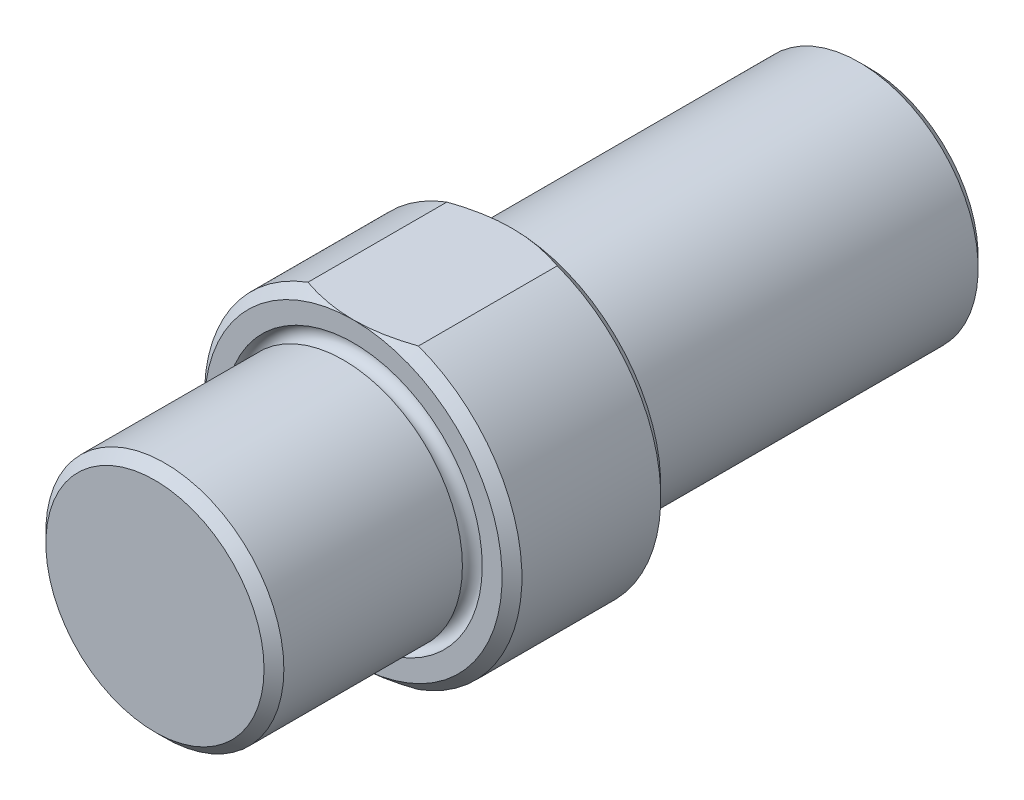
ISO-10303-21;
HEADER;
FILE_DESCRIPTION(('STEP AP214'),'2;1');
FILE_NAME('part.step','',(''),(''),'','','');
FILE_SCHEMA(('AUTOMOTIVE_DESIGN { 1 0 10303 214 1 1 1 1 }'));
ENDSEC;
DATA;
#1=APPLICATION_CONTEXT('core data for automotive mechanical design processes');
#2=APPLICATION_PROTOCOL_DEFINITION('international standard','automotive_design',2000,#1);
#3=PRODUCT_CONTEXT('',#1,'mechanical');
#4=PRODUCT('Part','Part','',(#3));
#5=PRODUCT_RELATED_PRODUCT_CATEGORY('part','',(#4));
#6=PRODUCT_DEFINITION_FORMATION('','',#4);
#7=PRODUCT_DEFINITION_CONTEXT('part definition',#1,'design');
#8=PRODUCT_DEFINITION('design','',#6,#7);
#9=PRODUCT_DEFINITION_SHAPE('','',#8);
#10=(LENGTH_UNIT() NAMED_UNIT(*) SI_UNIT(.MILLI.,.METRE.));
#11=(NAMED_UNIT(*) PLANE_ANGLE_UNIT() SI_UNIT($,.RADIAN.));
#12=(NAMED_UNIT(*) SI_UNIT($,.STERADIAN.) SOLID_ANGLE_UNIT());
#13=UNCERTAINTY_MEASURE_WITH_UNIT(LENGTH_MEASURE(1.E-05),#10,'distance_accuracy_value','');
#14=(GEOMETRIC_REPRESENTATION_CONTEXT(3) GLOBAL_UNCERTAINTY_ASSIGNED_CONTEXT((#13)) GLOBAL_UNIT_ASSIGNED_CONTEXT((#10,
#11,#12)) REPRESENTATION_CONTEXT('',''));
#15=CARTESIAN_POINT('',(0.,0.,0.));
#16=DIRECTION('',(0.,0.,1.));
#17=DIRECTION('',(1.,0.,0.));
#18=AXIS2_PLACEMENT_3D('',#15,#16,#17);
#19=CARTESIAN_POINT('',(0.,0.,-9.));
#20=DIRECTION('',(0.,0.,-1.));
#21=DIRECTION('',(-1.,0.,0.));
#22=AXIS2_PLACEMENT_3D('',#19,#20,#21);
#23=CYLINDRICAL_SURFACE('',#22,4.);
#24=DIRECTION('',(0.,0.,-1.));
#25=VECTOR('',#24,1.);
#26=CARTESIAN_POINT('',(-1.39194109070751,3.75,9.001));
#27=LINE('',#26,#25);
#28=CARTESIAN_POINT('',(-1.39194109070751,3.75,3.75));
#29=VERTEX_POINT('',#28);
#30=CARTESIAN_POINT('',(-1.39194109070751,3.75,0.250000000000002));
#31=VERTEX_POINT('',#30);
#32=EDGE_CURVE('E105',#29,#31,#27,.T.);
#33=ORIENTED_EDGE('',*,*,#32,.T.);
#34=CARTESIAN_POINT('',(0.,0.,0.250000000000002));
#35=DIRECTION('',(0.,0.,-1.));
#36=DIRECTION('',(-1.,0.,0.));
#37=AXIS2_PLACEMENT_3D('',#34,#35,#36);
#38=CIRCLE('',#37,4.);
#39=CARTESIAN_POINT('',(-1.39194109070751,-3.75,0.250000000000002));
#40=VERTEX_POINT('',#39);
#41=EDGE_CURVE('E120',#31,#40,#38,.F.);
#42=ORIENTED_EDGE('',*,*,#41,.T.);
#43=DIRECTION('',(0.,0.,-1.));
#44=VECTOR('',#43,1.);
#45=CARTESIAN_POINT('',(-1.39194109070751,-3.75,9.001));
#46=LINE('',#45,#44);
#47=CARTESIAN_POINT('',(-1.39194109070751,-3.75,3.75));
#48=VERTEX_POINT('',#47);
#49=EDGE_CURVE('E116',#48,#40,#46,.T.);
#50=ORIENTED_EDGE('',*,*,#49,.F.);
#51=CARTESIAN_POINT('',(0.,0.,3.75));
#52=DIRECTION('',(0.,0.,1.));
#53=DIRECTION('',(1.,0.,0.));
#54=AXIS2_PLACEMENT_3D('',#51,#52,#53);
#55=CIRCLE('',#54,4.);
#56=EDGE_CURVE('E126',#48,#29,#55,.F.);
#57=ORIENTED_EDGE('',*,*,#56,.T.);
#58=EDGE_LOOP('',(#33,#42,#50,#57));
#59=FACE_BOUND('',#58,.T.);
#60=ADVANCED_FACE('F36',(#59),#23,.T.);
#61=DIRECTION('',(0.,0.,-1.));
#62=VECTOR('',#61,1.);
#63=CARTESIAN_POINT('',(1.39194109070751,3.75,9.001));
#64=LINE('',#63,#62);
#65=CARTESIAN_POINT('',(1.39194109070751,3.75,3.75));
#66=VERTEX_POINT('',#65);
#67=CARTESIAN_POINT('',(1.39194109070751,3.75,0.250000000000002));
#68=VERTEX_POINT('',#67);
#69=EDGE_CURVE('E94',#66,#68,#64,.T.);
#70=ORIENTED_EDGE('',*,*,#69,.F.);
#71=CARTESIAN_POINT('',(1.39194109070751,-3.75,3.75));
#72=VERTEX_POINT('',#71);
#73=EDGE_CURVE('E128',#66,#72,#55,.F.);
#74=ORIENTED_EDGE('',*,*,#73,.T.);
#75=DIRECTION('',(0.,0.,-1.));
#76=VECTOR('',#75,1.);
#77=CARTESIAN_POINT('',(1.39194109070751,-3.75,9.001));
#78=LINE('',#77,#76);
#79=CARTESIAN_POINT('',(1.39194109070751,-3.75,0.250000000000002));
#80=VERTEX_POINT('',#79);
#81=EDGE_CURVE('E57',#72,#80,#78,.T.);
#82=ORIENTED_EDGE('',*,*,#81,.T.);
#83=EDGE_CURVE('E112',#80,#68,#38,.F.);
#84=ORIENTED_EDGE('',*,*,#83,.T.);
#85=EDGE_LOOP('',(#70,#74,#82,#84));
#86=FACE_BOUND('',#85,.T.);
#87=ADVANCED_FACE('F118',(#86),#23,.T.);
#88=CARTESIAN_POINT('',(0.,0.,0.));
#89=DIRECTION('',(0.,0.,1.));
#90=DIRECTION('',(1.,0.,0.));
#91=AXIS2_PLACEMENT_3D('',#88,#89,#90);
#92=CONICAL_SURFACE('',#91,3.75,0.785398163397448);
#93=CARTESIAN_POINT('',(-2.83990302461033,3.75,0.953992898505576));
#94=CARTESIAN_POINT('',(-2.7700876978384,3.75,0.911848513247995));
#95=CARTESIAN_POINT('',(-2.69984026379134,3.75,0.870421234461964));
#96=CARTESIAN_POINT('',(-2.55837884209773,3.75,0.789211299667289));
#97=CARTESIAN_POINT('',(-2.48716461766492,3.75,0.749429056578152));
#98=CARTESIAN_POINT('',(-2.27139059548043,3.75,0.632582593046648));
#99=CARTESIAN_POINT('',(-2.12526282812416,3.75,0.558363208487286));
#100=CARTESIAN_POINT('',(-1.82547988151603,3.75,0.418567933278475));
#101=CARTESIAN_POINT('',(-1.67173431523207,3.75,0.353183752552045));
#102=CARTESIAN_POINT('',(-1.35927190282821,3.75,0.236130087775243));
#103=CARTESIAN_POINT('',(-1.20056430539099,3.75,0.18443661216764));
#104=CARTESIAN_POINT('',(-0.946149795688594,3.75,0.11647014506675));
#105=CARTESIAN_POINT('',(-0.85197236253903,3.75,0.0944385679532498));
#106=CARTESIAN_POINT('',(-0.662301493652173,3.75,0.0569028380975851));
#107=CARTESIAN_POINT('',(-0.566807994216014,3.75,0.0413990024583298));
#108=CARTESIAN_POINT('',(-0.375790116903576,3.75,0.0176016198684037));
#109=CARTESIAN_POINT('',(-0.280273737092508,3.75,0.00924449484104384));
#110=CARTESIAN_POINT('',(-0.088878098705273,3.75,-0.0001651186600835));
#111=CARTESIAN_POINT('',(0.00700116817843397,3.75,-0.00121743888119184));
#112=CARTESIAN_POINT('',(0.214560681022876,3.75,0.00447257727150637));
#113=CARTESIAN_POINT('',(0.326206265213885,3.75,0.0125456924188819));
#114=CARTESIAN_POINT('',(0.548388105524635,3.75,0.0382764686106016));
#115=CARTESIAN_POINT('',(0.658924130416132,3.75,0.0559360868815942));
#116=CARTESIAN_POINT('',(0.87963236825723,3.75,0.100247950720254));
#117=CARTESIAN_POINT('',(0.989781727852693,3.75,0.127012639235166));
#118=CARTESIAN_POINT('',(1.20784034622565,3.75,0.188327582182318));
#119=CARTESIAN_POINT('',(1.31575000876604,3.75,0.222876419771478));
#120=CARTESIAN_POINT('',(1.55071732291589,3.75,0.306209928863826));
#121=CARTESIAN_POINT('',(1.67725179091024,3.75,0.356460362006968));
#122=CARTESIAN_POINT('',(1.92702140820888,3.75,0.464644449458482));
#123=CARTESIAN_POINT('',(2.05025490423548,3.75,0.522581870373216));
#124=CARTESIAN_POINT('',(2.29404704517215,3.75,0.644768318976301));
#125=CARTESIAN_POINT('',(2.41459529351872,3.75,0.709037929671192));
#126=CARTESIAN_POINT('',(2.65291313964417,3.75,0.842461488598317));
#127=CARTESIAN_POINT('',(2.7706831940413,3.75,0.911614626616626));
#128=CARTESIAN_POINT('',(2.99867808102538,3.75,1.05070605159649));
#129=CARTESIAN_POINT('',(3.10900662010968,3.75,1.12047523006144));
#130=CARTESIAN_POINT('',(3.32776138837851,3.75,1.26294433980188));
#131=CARTESIAN_POINT('',(3.43618746466738,3.75,1.33564450509829));
#132=CARTESIAN_POINT('',(3.6504914902698,3.75,1.48283495569862));
#133=CARTESIAN_POINT('',(3.75638311158588,3.75,1.5573054065924));
#134=CARTESIAN_POINT('',(3.96671630494178,3.75,1.70820733340868));
#135=CARTESIAN_POINT('',(4.07115827626302,3.75,1.78463825214523));
#136=CARTESIAN_POINT('',(4.17499451194071,3.75,1.86186949017304));
#137=B_SPLINE_CURVE_WITH_KNOTS('',3,(#93,#94,#95,#96,#97,#98,#99,#100,#101,#102,#103,#104,#105,
#106,#107,#108,#109,#110,#111,#112,#113,#114,#115,#116,#117,#118,#119,#120,#121,#122,#123,#124,
#125,#126,#127,#128,#129,#130,#131,#132,#133,#134,#135,#136),.UNSPECIFIED.,.F.,.F.,(4,2,2,2,2,2,
2,2,2,2,2,2,2,2,2,2,2,2,2,2,2,4),(0.,0.244640033858274,0.489341106472247,0.980722318903447,
1.48146935334974,1.98133298505972,2.27129835540577,2.56127780998864,2.84864990570157,
3.13602862047691,3.47138980730315,3.80681948884968,4.14655173037683,4.48622218493553,
4.89433802676435,5.30265458809713,5.71234516832156,6.12196793676241,6.51352671514245,
6.90511681919381,7.29346089465381,7.68169579547187),.UNSPECIFIED.);
#138=CARTESIAN_POINT('',(0.,3.75,0.));
#139=VERTEX_POINT('',#138);
#140=EDGE_CURVE('E97',#139,#68,#137,.T.);
#141=ORIENTED_EDGE('',*,*,#140,.T.);
#142=ORIENTED_EDGE('',*,*,#83,.F.);
#143=CARTESIAN_POINT('',(-2.83990302461033,-3.75,0.953992898505576));
#144=CARTESIAN_POINT('',(-2.7700876978384,-3.75,0.911848513247995));
#145=CARTESIAN_POINT('',(-2.69984026379134,-3.75,0.870421234461964));
#146=CARTESIAN_POINT('',(-2.55837884209773,-3.75,0.789211299667289));
#147=CARTESIAN_POINT('',(-2.48716461766492,-3.75,0.749429056578152));
#148=CARTESIAN_POINT('',(-2.27139059548043,-3.75,0.632582593046648));
#149=CARTESIAN_POINT('',(-2.12526282812416,-3.75,0.558363208487286));
#150=CARTESIAN_POINT('',(-1.82547988151603,-3.75,0.418567933278475));
#151=CARTESIAN_POINT('',(-1.67173431523207,-3.75,0.353183752552045));
#152=CARTESIAN_POINT('',(-1.35927190282821,-3.75,0.236130087775243));
#153=CARTESIAN_POINT('',(-1.20056430539099,-3.75,0.18443661216764));
#154=CARTESIAN_POINT('',(-0.946149795688594,-3.75,0.11647014506675));
#155=CARTESIAN_POINT('',(-0.85197236253903,-3.75,0.0944385679532498));
#156=CARTESIAN_POINT('',(-0.662301493652173,-3.75,0.0569028380975851));
#157=CARTESIAN_POINT('',(-0.566807994216014,-3.75,0.0413990024583298));
#158=CARTESIAN_POINT('',(-0.375790116903576,-3.75,0.0176016198684037));
#159=CARTESIAN_POINT('',(-0.280273737092508,-3.75,0.00924449484104384));
#160=CARTESIAN_POINT('',(-0.088878098705273,-3.75,-0.0001651186600835));
#161=CARTESIAN_POINT('',(0.00700116817843397,-3.75,-0.00121743888119184));
#162=CARTESIAN_POINT('',(0.214560681022876,-3.75,0.00447257727150637));
#163=CARTESIAN_POINT('',(0.326206265213885,-3.75,0.0125456924188819));
#164=CARTESIAN_POINT('',(0.548388105524635,-3.75,0.0382764686106016));
#165=CARTESIAN_POINT('',(0.658924130416132,-3.75,0.0559360868815942));
#166=CARTESIAN_POINT('',(0.87963236825723,-3.75,0.100247950720254));
#167=CARTESIAN_POINT('',(0.989781727852693,-3.75,0.127012639235166));
#168=CARTESIAN_POINT('',(1.20784034622565,-3.75,0.188327582182318));
#169=CARTESIAN_POINT('',(1.31575000876604,-3.75,0.222876419771478));
#170=CARTESIAN_POINT('',(1.55071732291589,-3.75,0.306209928863826));
#171=CARTESIAN_POINT('',(1.67725179091024,-3.75,0.356460362006968));
#172=CARTESIAN_POINT('',(1.92702140820888,-3.75,0.464644449458482));
#173=CARTESIAN_POINT('',(2.05025490423548,-3.75,0.522581870373216));
#174=CARTESIAN_POINT('',(2.29404704517215,-3.75,0.644768318976301));
#175=CARTESIAN_POINT('',(2.41459529351872,-3.75,0.709037929671192));
#176=CARTESIAN_POINT('',(2.65291313964417,-3.75,0.842461488598317));
#177=CARTESIAN_POINT('',(2.7706831940413,-3.75,0.911614626616626));
#178=CARTESIAN_POINT('',(2.99867808102538,-3.75,1.05070605159649));
#179=CARTESIAN_POINT('',(3.10900662010968,-3.75,1.12047523006144));
#180=CARTESIAN_POINT('',(3.32776138837851,-3.75,1.26294433980188));
#181=CARTESIAN_POINT('',(3.43618746466738,-3.75,1.33564450509829));
#182=CARTESIAN_POINT('',(3.6504914902698,-3.75,1.48283495569862));
#183=CARTESIAN_POINT('',(3.75638311158588,-3.75,1.5573054065924));
#184=CARTESIAN_POINT('',(3.96671630494178,-3.75,1.70820733340868));
#185=CARTESIAN_POINT('',(4.07115827626302,-3.75,1.78463825214523));
#186=CARTESIAN_POINT('',(4.17499451194071,-3.75,1.86186949017304));
#187=B_SPLINE_CURVE_WITH_KNOTS('',3,(#143,#144,#145,#146,#147,#148,#149,#150,#151,#152,#153,
#154,#155,#156,#157,#158,#159,#160,#161,#162,#163,#164,#165,#166,#167,#168,#169,#170,#171,#172,
#173,#174,#175,#176,#177,#178,#179,#180,#181,#182,#183,#184,#185,#186),.UNSPECIFIED.,.F.,.F.,(4,
2,2,2,2,2,2,2,2,2,2,2,2,2,2,2,2,2,2,2,2,4),(0.,0.244640033858274,0.489341106472247,
0.980722318903447,1.48146935334974,1.98133298505972,2.27129835540577,2.56127780998864,
2.84864990570157,3.13602862047691,3.47138980730315,3.80681948884968,4.14655173037683,
4.48622218493553,4.89433802676435,5.30265458809713,5.71234516832156,6.12196793676241,
6.51352671514245,6.90511681919381,7.29346089465381,7.68169579547187),.UNSPECIFIED.);
#188=CARTESIAN_POINT('',(0.,-3.75,0.));
#189=VERTEX_POINT('',#188);
#190=EDGE_CURVE('E424',#189,#80,#187,.T.);
#191=ORIENTED_EDGE('',*,*,#190,.F.);
#192=CARTESIAN_POINT('',(0.,0.,0.));
#193=DIRECTION('',(0.,0.,-1.));
#194=DIRECTION('',(-1.,0.,0.));
#195=AXIS2_PLACEMENT_3D('',#192,#193,#194);
#196=CIRCLE('',#195,3.75);
#197=EDGE_CURVE('E114',#139,#189,#196,.T.);
#198=ORIENTED_EDGE('',*,*,#197,.F.);
#199=EDGE_LOOP('',(#141,#142,#191,#198));
#200=FACE_BOUND('',#199,.T.);
#201=ADVANCED_FACE('F110',(#200),#92,.T.);
#202=EDGE_CURVE('E115',#31,#139,#137,.T.);
#203=ORIENTED_EDGE('',*,*,#202,.T.);
#204=EDGE_CURVE('E192',#189,#139,#196,.T.);
#205=ORIENTED_EDGE('',*,*,#204,.F.);
#206=EDGE_CURVE('E164',#40,#189,#187,.T.);
#207=ORIENTED_EDGE('',*,*,#206,.F.);
#208=ORIENTED_EDGE('',*,*,#41,.F.);
#209=EDGE_LOOP('',(#203,#205,#207,#208));
#210=FACE_BOUND('',#209,.T.);
#211=ADVANCED_FACE('F203',(#210),#92,.T.);
#212=CARTESIAN_POINT('',(0.,0.,3.75));
#213=DIRECTION('',(0.,0.,-1.));
#214=DIRECTION('',(-1.,0.,0.));
#215=AXIS2_PLACEMENT_3D('',#212,#213,#214);
#216=CONICAL_SURFACE('',#215,4.,0.785398163397452);
#217=CARTESIAN_POINT('',(-2.83990302461034,3.75,3.04600710149442));
#218=CARTESIAN_POINT('',(-2.77008769783841,3.75,3.088151486752));
#219=CARTESIAN_POINT('',(-2.69984026379134,3.75,3.12957876553803));
#220=CARTESIAN_POINT('',(-2.55837884209774,3.75,3.21078870033271));
#221=CARTESIAN_POINT('',(-2.48716461766493,3.75,3.25057094342185));
#222=CARTESIAN_POINT('',(-2.27139059548043,3.75,3.36741740695335));
#223=CARTESIAN_POINT('',(-2.12526282812416,3.75,3.44163679151271));
#224=CARTESIAN_POINT('',(-1.82547988151603,3.75,3.58143206672152));
#225=CARTESIAN_POINT('',(-1.67173431523207,3.75,3.64681624744795));
#226=CARTESIAN_POINT('',(-1.35927190282822,3.75,3.76386991222475));
#227=CARTESIAN_POINT('',(-1.20056430539099,3.75,3.81556338783236));
#228=CARTESIAN_POINT('',(-0.946149795688595,3.75,3.88352985493325));
#229=CARTESIAN_POINT('',(-0.851972362539031,3.75,3.90556143204675));
#230=CARTESIAN_POINT('',(-0.662301493652174,3.75,3.94309716190241));
#231=CARTESIAN_POINT('',(-0.566807994216016,3.75,3.95860099754167));
#232=CARTESIAN_POINT('',(-0.375790116903577,3.75,3.98239838013159));
#233=CARTESIAN_POINT('',(-0.28027373709251,3.75,3.99075550515895));
#234=CARTESIAN_POINT('',(-0.0888780987052748,3.75,4.00016511866008));
#235=CARTESIAN_POINT('',(0.00700116817843205,3.75,4.00121743888119));
#236=CARTESIAN_POINT('',(0.214560681022875,3.75,3.99552742272849));
#237=CARTESIAN_POINT('',(0.326206265213884,3.75,3.98745430758111));
#238=CARTESIAN_POINT('',(0.548388105524637,3.75,3.96172353138939));
#239=CARTESIAN_POINT('',(0.658924130416134,3.75,3.9440639131184));
#240=CARTESIAN_POINT('',(0.879632368257233,3.75,3.89975204927974));
#241=CARTESIAN_POINT('',(0.989781727852697,3.75,3.87298736076483));
#242=CARTESIAN_POINT('',(1.20784034622566,3.75,3.81167241781768));
#243=CARTESIAN_POINT('',(1.31575000876605,3.75,3.77712358022852));
#244=CARTESIAN_POINT('',(1.5507173229159,3.75,3.69379007113617));
#245=CARTESIAN_POINT('',(1.67725179091025,3.75,3.64353963799303));
#246=CARTESIAN_POINT('',(1.9270214082089,3.75,3.53535555054151));
#247=CARTESIAN_POINT('',(2.05025490423549,3.75,3.47741812962678));
#248=CARTESIAN_POINT('',(2.29404704517217,3.75,3.35523168102369));
#249=CARTESIAN_POINT('',(2.41459529351874,3.75,3.2909620703288));
#250=CARTESIAN_POINT('',(2.6529131396442,3.75,3.15753851140167));
#251=CARTESIAN_POINT('',(2.77068319404133,3.75,3.08838537338336));
#252=CARTESIAN_POINT('',(2.9986780810254,3.75,2.9492939484035));
#253=CARTESIAN_POINT('',(3.10900662010971,3.75,2.87952476993854));
#254=CARTESIAN_POINT('',(3.32776138837854,3.75,2.7370556601981));
#255=CARTESIAN_POINT('',(3.43618746466741,3.75,2.6643554949017));
#256=CARTESIAN_POINT('',(3.65049149026984,3.75,2.51716504430136));
#257=CARTESIAN_POINT('',(3.75638311158592,3.75,2.44269459340758));
#258=CARTESIAN_POINT('',(3.96671630494182,3.75,2.2917926665913));
#259=CARTESIAN_POINT('',(4.07115827626306,3.75,2.21536174785475));
#260=CARTESIAN_POINT('',(4.17499451194075,3.75,2.13813050982694));
#261=B_SPLINE_CURVE_WITH_KNOTS('',3,(#217,#218,#219,#220,#221,#222,#223,#224,#225,#226,#227,
#228,#229,#230,#231,#232,#233,#234,#235,#236,#237,#238,#239,#240,#241,#242,#243,#244,#245,#246,
#247,#248,#249,#250,#251,#252,#253,#254,#255,#256,#257,#258,#259,#260),.UNSPECIFIED.,.F.,.F.,(4,
2,2,2,2,2,2,2,2,2,2,2,2,2,2,2,2,2,2,2,2,4),(0.,0.244640033858276,0.489341106472249,
0.980722318903451,1.48146935334975,1.98133298505973,2.27129835540577,2.56127780998864,
2.84864990570158,3.13602862047691,3.47138980730316,3.80681948884969,4.14655173037685,
4.48622218493554,4.89433802676437,5.30265458809715,5.71234516832159,6.12196793676244,
6.51352671514249,6.90511681919386,7.29346089465386,7.68169579547192),.UNSPECIFIED.);
#262=CARTESIAN_POINT('',(0.,3.75,4.));
#263=VERTEX_POINT('',#262);
#264=EDGE_CURVE('E11',#29,#263,#261,.T.);
#265=ORIENTED_EDGE('',*,*,#264,.F.);
#266=ORIENTED_EDGE('',*,*,#56,.F.);
#267=CARTESIAN_POINT('',(-2.83990302461034,-3.75,3.04600710149442));
#268=CARTESIAN_POINT('',(-2.77008769783841,-3.75,3.088151486752));
#269=CARTESIAN_POINT('',(-2.69984026379134,-3.75,3.12957876553803));
#270=CARTESIAN_POINT('',(-2.55837884209774,-3.75,3.21078870033271));
#271=CARTESIAN_POINT('',(-2.48716461766493,-3.75,3.25057094342185));
#272=CARTESIAN_POINT('',(-2.27139059548043,-3.75,3.36741740695335));
#273=CARTESIAN_POINT('',(-2.12526282812416,-3.75,3.44163679151271));
#274=CARTESIAN_POINT('',(-1.82547988151603,-3.75,3.58143206672152));
#275=CARTESIAN_POINT('',(-1.67173431523207,-3.75,3.64681624744795));
#276=CARTESIAN_POINT('',(-1.35927190282822,-3.75,3.76386991222475));
#277=CARTESIAN_POINT('',(-1.20056430539099,-3.75,3.81556338783236));
#278=CARTESIAN_POINT('',(-0.946149795688595,-3.75,3.88352985493325));
#279=CARTESIAN_POINT('',(-0.851972362539031,-3.75,3.90556143204675));
#280=CARTESIAN_POINT('',(-0.662301493652174,-3.75,3.94309716190241));
#281=CARTESIAN_POINT('',(-0.566807994216016,-3.75,3.95860099754167));
#282=CARTESIAN_POINT('',(-0.375790116903577,-3.75,3.98239838013159));
#283=CARTESIAN_POINT('',(-0.28027373709251,-3.75,3.99075550515895));
#284=CARTESIAN_POINT('',(-0.0888780987052748,-3.75,4.00016511866008));
#285=CARTESIAN_POINT('',(0.00700116817843205,-3.75,4.00121743888119));
#286=CARTESIAN_POINT('',(0.214560681022875,-3.75,3.99552742272849));
#287=CARTESIAN_POINT('',(0.326206265213884,-3.75,3.98745430758111));
#288=CARTESIAN_POINT('',(0.548388105524637,-3.75,3.96172353138939));
#289=CARTESIAN_POINT('',(0.658924130416134,-3.75,3.9440639131184));
#290=CARTESIAN_POINT('',(0.879632368257233,-3.75,3.89975204927974));
#291=CARTESIAN_POINT('',(0.989781727852697,-3.75,3.87298736076483));
#292=CARTESIAN_POINT('',(1.20784034622566,-3.75,3.81167241781768));
#293=CARTESIAN_POINT('',(1.31575000876605,-3.75,3.77712358022852));
#294=CARTESIAN_POINT('',(1.5507173229159,-3.75,3.69379007113617));
#295=CARTESIAN_POINT('',(1.67725179091025,-3.75,3.64353963799303));
#296=CARTESIAN_POINT('',(1.9270214082089,-3.75,3.53535555054151));
#297=CARTESIAN_POINT('',(2.05025490423549,-3.75,3.47741812962678));
#298=CARTESIAN_POINT('',(2.29404704517217,-3.75,3.35523168102369));
#299=CARTESIAN_POINT('',(2.41459529351874,-3.75,3.2909620703288));
#300=CARTESIAN_POINT('',(2.6529131396442,-3.75,3.15753851140167));
#301=CARTESIAN_POINT('',(2.77068319404133,-3.75,3.08838537338336));
#302=CARTESIAN_POINT('',(2.9986780810254,-3.75,2.9492939484035));
#303=CARTESIAN_POINT('',(3.10900662010971,-3.75,2.87952476993854));
#304=CARTESIAN_POINT('',(3.32776138837854,-3.75,2.7370556601981));
#305=CARTESIAN_POINT('',(3.43618746466741,-3.75,2.6643554949017));
#306=CARTESIAN_POINT('',(3.65049149026984,-3.75,2.51716504430136));
#307=CARTESIAN_POINT('',(3.75638311158592,-3.75,2.44269459340758));
#308=CARTESIAN_POINT('',(3.96671630494182,-3.75,2.2917926665913));
#309=CARTESIAN_POINT('',(4.07115827626306,-3.75,2.21536174785475));
#310=CARTESIAN_POINT('',(4.17499451194075,-3.75,2.13813050982694));
#311=B_SPLINE_CURVE_WITH_KNOTS('',3,(#267,#268,#269,#270,#271,#272,#273,#274,#275,#276,#277,
#278,#279,#280,#281,#282,#283,#284,#285,#286,#287,#288,#289,#290,#291,#292,#293,#294,#295,#296,
#297,#298,#299,#300,#301,#302,#303,#304,#305,#306,#307,#308,#309,#310),.UNSPECIFIED.,.F.,.F.,(4,
2,2,2,2,2,2,2,2,2,2,2,2,2,2,2,2,2,2,2,2,4),(0.,0.244640033858276,0.489341106472249,
0.980722318903451,1.48146935334975,1.98133298505973,2.27129835540577,2.56127780998864,
2.84864990570158,3.13602862047691,3.47138980730316,3.80681948884969,4.14655173037685,
4.48622218493554,4.89433802676437,5.30265458809715,5.71234516832159,6.12196793676244,
6.51352671514249,6.90511681919386,7.29346089465386,7.68169579547192),.UNSPECIFIED.);
#312=CARTESIAN_POINT('',(0.,-3.75,4.));
#313=VERTEX_POINT('',#312);
#314=EDGE_CURVE('E50',#48,#313,#311,.T.);
#315=ORIENTED_EDGE('',*,*,#314,.T.);
#316=CARTESIAN_POINT('',(0.,0.,4.));
#317=DIRECTION('',(0.,0.,1.));
#318=DIRECTION('',(1.,0.,0.));
#319=AXIS2_PLACEMENT_3D('',#316,#317,#318);
#320=CIRCLE('',#319,3.75);
#321=EDGE_CURVE('E123',#263,#313,#320,.T.);
#322=ORIENTED_EDGE('',*,*,#321,.F.);
#323=EDGE_LOOP('',(#265,#266,#315,#322));
#324=FACE_BOUND('',#323,.T.);
#325=ADVANCED_FACE('F149',(#324),#216,.T.);
#326=CARTESIAN_POINT('',(-2.83990302461033,3.75,3.04600710149442));
#327=CARTESIAN_POINT('',(-2.77008769783841,3.75,3.088151486752));
#328=CARTESIAN_POINT('',(-2.69984026379134,3.75,3.12957876553804));
#329=CARTESIAN_POINT('',(-2.55837884209773,3.75,3.21078870033271));
#330=CARTESIAN_POINT('',(-2.48716461766493,3.75,3.25057094342185));
#331=CARTESIAN_POINT('',(-2.27139059548043,3.75,3.36741740695335));
#332=CARTESIAN_POINT('',(-2.12526282812416,3.75,3.44163679151271));
#333=CARTESIAN_POINT('',(-1.82547988151603,3.75,3.58143206672152));
#334=CARTESIAN_POINT('',(-1.67173431523207,3.75,3.64681624744795));
#335=CARTESIAN_POINT('',(-1.35927190282821,3.75,3.76386991222476));
#336=CARTESIAN_POINT('',(-1.20056430539099,3.75,3.81556338783236));
#337=CARTESIAN_POINT('',(-0.946149795688594,3.75,3.88352985493325));
#338=CARTESIAN_POINT('',(-0.85197236253903,3.75,3.90556143204675));
#339=CARTESIAN_POINT('',(-0.662301493652174,3.75,3.94309716190241));
#340=CARTESIAN_POINT('',(-0.566807994216015,3.75,3.95860099754167));
#341=CARTESIAN_POINT('',(-0.375790116903577,3.75,3.98239838013159));
#342=CARTESIAN_POINT('',(-0.280273737092509,3.75,3.99075550515895));
#343=CARTESIAN_POINT('',(-0.0888780987052745,3.75,4.00016511866008));
#344=CARTESIAN_POINT('',(0.00700116817843228,3.75,4.00121743888119));
#345=CARTESIAN_POINT('',(0.214560681022875,3.75,3.99552742272849));
#346=CARTESIAN_POINT('',(0.326206265213884,3.75,3.98745430758111));
#347=CARTESIAN_POINT('',(0.548388105524637,3.75,3.96172353138939));
#348=CARTESIAN_POINT('',(0.658924130416134,3.75,3.9440639131184));
#349=CARTESIAN_POINT('',(0.879632368257233,3.75,3.89975204927974));
#350=CARTESIAN_POINT('',(0.989781727852698,3.75,3.87298736076483));
#351=CARTESIAN_POINT('',(1.20784034622566,3.75,3.81167241781768));
#352=CARTESIAN_POINT('',(1.31575000876605,3.75,3.77712358022852));
#353=CARTESIAN_POINT('',(1.5507173229159,3.75,3.69379007113617));
#354=CARTESIAN_POINT('',(1.67725179091025,3.75,3.64353963799303));
#355=CARTESIAN_POINT('',(1.9270214082089,3.75,3.53535555054151));
#356=CARTESIAN_POINT('',(2.0502549042355,3.75,3.47741812962678));
#357=CARTESIAN_POINT('',(2.29404704517217,3.75,3.35523168102369));
#358=CARTESIAN_POINT('',(2.41459529351874,3.75,3.2909620703288));
#359=CARTESIAN_POINT('',(2.6529131396442,3.75,3.15753851140167));
#360=CARTESIAN_POINT('',(2.77068319404133,3.75,3.08838537338336));
#361=CARTESIAN_POINT('',(2.9986780810254,3.75,2.9492939484035));
#362=CARTESIAN_POINT('',(3.10900662010971,3.75,2.87952476993854));
#363=CARTESIAN_POINT('',(3.32776138837854,3.75,2.7370556601981));
#364=CARTESIAN_POINT('',(3.43618746466741,3.75,2.6643554949017));
#365=CARTESIAN_POINT('',(3.65049149026984,3.75,2.51716504430136));
#366=CARTESIAN_POINT('',(3.75638311158592,3.75,2.44269459340758));
#367=CARTESIAN_POINT('',(3.96671630494182,3.75,2.2917926665913));
#368=CARTESIAN_POINT('',(4.07115827626306,3.75,2.21536174785475));
#369=CARTESIAN_POINT('',(4.17499451194075,3.75,2.13813050982694));
#370=B_SPLINE_CURVE_WITH_KNOTS('',3,(#326,#327,#328,#329,#330,#331,#332,#333,#334,#335,#336,
#337,#338,#339,#340,#341,#342,#343,#344,#345,#346,#347,#348,#349,#350,#351,#352,#353,#354,#355,
#356,#357,#358,#359,#360,#361,#362,#363,#364,#365,#366,#367,#368,#369),.UNSPECIFIED.,.F.,.F.,(4,
2,2,2,2,2,2,2,2,2,2,2,2,2,2,2,2,2,2,2,2,4),(0.,0.244640033858276,0.489341106472249,
0.980722318903452,1.48146935334975,1.98133298505973,2.27129835540577,2.56127780998864,
2.84864990570158,3.13602862047691,3.47138980730315,3.80681948884969,4.14655173037684,
4.48622218493554,4.89433802676437,5.30265458809715,5.71234516832159,6.12196793676244,
6.51352671514248,6.90511681919386,7.29346089465386,7.68169579547192),.UNSPECIFIED.);
#371=EDGE_CURVE('E99',#66,#263,#370,.F.);
#372=ORIENTED_EDGE('',*,*,#371,.T.);
#373=EDGE_CURVE('E119',#313,#263,#320,.T.);
#374=ORIENTED_EDGE('',*,*,#373,.F.);
#375=CARTESIAN_POINT('',(-2.83990302461033,-3.75,3.04600710149442));
#376=CARTESIAN_POINT('',(-2.77008769783841,-3.75,3.088151486752));
#377=CARTESIAN_POINT('',(-2.69984026379134,-3.75,3.12957876553804));
#378=CARTESIAN_POINT('',(-2.55837884209773,-3.75,3.21078870033271));
#379=CARTESIAN_POINT('',(-2.48716461766493,-3.75,3.25057094342185));
#380=CARTESIAN_POINT('',(-2.27139059548043,-3.75,3.36741740695335));
#381=CARTESIAN_POINT('',(-2.12526282812416,-3.75,3.44163679151271));
#382=CARTESIAN_POINT('',(-1.82547988151603,-3.75,3.58143206672152));
#383=CARTESIAN_POINT('',(-1.67173431523207,-3.75,3.64681624744795));
#384=CARTESIAN_POINT('',(-1.35927190282821,-3.75,3.76386991222476));
#385=CARTESIAN_POINT('',(-1.20056430539099,-3.75,3.81556338783236));
#386=CARTESIAN_POINT('',(-0.946149795688594,-3.75,3.88352985493325));
#387=CARTESIAN_POINT('',(-0.85197236253903,-3.75,3.90556143204675));
#388=CARTESIAN_POINT('',(-0.662301493652174,-3.75,3.94309716190241));
#389=CARTESIAN_POINT('',(-0.566807994216015,-3.75,3.95860099754167));
#390=CARTESIAN_POINT('',(-0.375790116903577,-3.75,3.98239838013159));
#391=CARTESIAN_POINT('',(-0.280273737092509,-3.75,3.99075550515895));
#392=CARTESIAN_POINT('',(-0.0888780987052745,-3.75,4.00016511866008));
#393=CARTESIAN_POINT('',(0.00700116817843228,-3.75,4.00121743888119));
#394=CARTESIAN_POINT('',(0.214560681022875,-3.75,3.99552742272849));
#395=CARTESIAN_POINT('',(0.326206265213884,-3.75,3.98745430758111));
#396=CARTESIAN_POINT('',(0.548388105524637,-3.75,3.96172353138939));
#397=CARTESIAN_POINT('',(0.658924130416134,-3.75,3.9440639131184));
#398=CARTESIAN_POINT('',(0.879632368257233,-3.75,3.89975204927974));
#399=CARTESIAN_POINT('',(0.989781727852698,-3.75,3.87298736076483));
#400=CARTESIAN_POINT('',(1.20784034622566,-3.75,3.81167241781768));
#401=CARTESIAN_POINT('',(1.31575000876605,-3.75,3.77712358022852));
#402=CARTESIAN_POINT('',(1.5507173229159,-3.75,3.69379007113617));
#403=CARTESIAN_POINT('',(1.67725179091025,-3.75,3.64353963799303));
#404=CARTESIAN_POINT('',(1.9270214082089,-3.75,3.53535555054151));
#405=CARTESIAN_POINT('',(2.0502549042355,-3.75,3.47741812962678));
#406=CARTESIAN_POINT('',(2.29404704517217,-3.75,3.35523168102369));
#407=CARTESIAN_POINT('',(2.41459529351874,-3.75,3.2909620703288));
#408=CARTESIAN_POINT('',(2.6529131396442,-3.75,3.15753851140167));
#409=CARTESIAN_POINT('',(2.77068319404133,-3.75,3.08838537338336));
#410=CARTESIAN_POINT('',(2.9986780810254,-3.75,2.9492939484035));
#411=CARTESIAN_POINT('',(3.10900662010971,-3.75,2.87952476993854));
#412=CARTESIAN_POINT('',(3.32776138837854,-3.75,2.7370556601981));
#413=CARTESIAN_POINT('',(3.43618746466741,-3.75,2.6643554949017));
#414=CARTESIAN_POINT('',(3.65049149026984,-3.75,2.51716504430136));
#415=CARTESIAN_POINT('',(3.75638311158592,-3.75,2.44269459340758));
#416=CARTESIAN_POINT('',(3.96671630494182,-3.75,2.2917926665913));
#417=CARTESIAN_POINT('',(4.07115827626306,-3.75,2.21536174785475));
#418=CARTESIAN_POINT('',(4.17499451194075,-3.75,2.13813050982694));
#419=B_SPLINE_CURVE_WITH_KNOTS('',3,(#375,#376,#377,#378,#379,#380,#381,#382,#383,#384,#385,
#386,#387,#388,#389,#390,#391,#392,#393,#394,#395,#396,#397,#398,#399,#400,#401,#402,#403,#404,
#405,#406,#407,#408,#409,#410,#411,#412,#413,#414,#415,#416,#417,#418),.UNSPECIFIED.,.F.,.F.,(4,
2,2,2,2,2,2,2,2,2,2,2,2,2,2,2,2,2,2,2,2,4),(0.,0.244640033858276,0.489341106472249,
0.980722318903452,1.48146935334975,1.98133298505973,2.27129835540577,2.56127780998864,
2.84864990570158,3.13602862047691,3.47138980730315,3.80681948884969,4.14655173037684,
4.48622218493554,4.89433802676437,5.30265458809715,5.71234516832159,6.12196793676244,
6.51352671514248,6.90511681919386,7.29346089465386,7.68169579547192),.UNSPECIFIED.);
#420=EDGE_CURVE('E171',#72,#313,#419,.F.);
#421=ORIENTED_EDGE('',*,*,#420,.F.);
#422=ORIENTED_EDGE('',*,*,#73,.F.);
#423=EDGE_LOOP('',(#372,#374,#421,#422));
#424=FACE_BOUND('',#423,.T.);
#425=ADVANCED_FACE('F247',(#424),#216,.T.);
#426=CARTESIAN_POINT('',(0.,0.,-9.));
#427=DIRECTION('',(0.,0.,-1.));
#428=DIRECTION('',(-1.,0.,0.));
#429=AXIS2_PLACEMENT_3D('',#426,#427,#428);
#430=CYLINDRICAL_SURFACE('',#429,3.00000000000001);
#431=CARTESIAN_POINT('',(0.,0.,-8.75));
#432=DIRECTION('',(0.,0.,-1.));
#433=DIRECTION('',(-1.,0.,0.));
#434=AXIS2_PLACEMENT_3D('',#431,#432,#433);
#435=CIRCLE('',#434,3.00000000000001);
#436=CARTESIAN_POINT('',(-3.00000000000001,0.,-8.75));
#437=VERTEX_POINT('',#436);
#438=EDGE_CURVE('E141',#437,#437,#435,.F.);
#439=ORIENTED_EDGE('',*,*,#438,.T.);
#440=EDGE_LOOP('',(#439));
#441=FACE_BOUND('',#440,.T.);
#442=CARTESIAN_POINT('',(0.,0.,-0.25));
#443=DIRECTION('',(0.,0.,1.));
#444=DIRECTION('',(1.,0.,0.));
#445=AXIS2_PLACEMENT_3D('',#442,#443,#444);
#446=CIRCLE('',#445,3.00000000000001);
#447=CARTESIAN_POINT('',(3.00000000000001,0.,-0.25));
#448=VERTEX_POINT('',#447);
#449=EDGE_CURVE('E182',#448,#448,#446,.F.);
#450=ORIENTED_EDGE('',*,*,#449,.T.);
#451=EDGE_LOOP('',(#450));
#452=FACE_BOUND('',#451,.T.);
#453=ADVANCED_FACE('F252',(#441,#452),#430,.T.);
#454=CARTESIAN_POINT('',(0.,3.,-9.));
#455=DIRECTION('',(0.,0.,-1.));
#456=DIRECTION('',(-1.,0.,0.));
#457=AXIS2_PLACEMENT_3D('',#454,#455,#456);
#458=PLANE('',#457);
#459=CARTESIAN_POINT('',(0.,0.,-9.));
#460=DIRECTION('',(0.,0.,-1.));
#461=DIRECTION('',(-1.,0.,0.));
#462=AXIS2_PLACEMENT_3D('',#459,#460,#461);
#463=CIRCLE('',#462,2.75000000000001);
#464=CARTESIAN_POINT('',(-2.75000000000001,0.,-9.));
#465=VERTEX_POINT('',#464);
#466=EDGE_CURVE('E138',#465,#465,#463,.T.);
#467=ORIENTED_EDGE('',*,*,#466,.T.);
#468=EDGE_LOOP('',(#467));
#469=FACE_BOUND('',#468,.T.);
#470=CARTESIAN_POINT('',(0.,0.,-9.));
#471=DIRECTION('',(0.,0.,-1.));
#472=DIRECTION('',(-1.,0.,0.));
#473=AXIS2_PLACEMENT_3D('',#470,#471,#472);
#474=CIRCLE('',#473,1.64999999999999);
#475=CARTESIAN_POINT('',(-1.64999999999999,0.,-9.));
#476=VERTEX_POINT('',#475);
#477=EDGE_CURVE('E186',#476,#476,#474,.T.);
#478=ORIENTED_EDGE('',*,*,#477,.F.);
#479=EDGE_LOOP('',(#478));
#480=FACE_BOUND('',#479,.T.);
#481=ADVANCED_FACE('F283',(#469,#480),#458,.T.);
#482=CARTESIAN_POINT('',(0.,0.,0.999999999999999));
#483=DIRECTION('',(0.,0.,-1.));
#484=DIRECTION('',(-1.,0.,0.));
#485=AXIS2_PLACEMENT_3D('',#482,#483,#484);
#486=CONICAL_SURFACE('',#485,1.65,1.02974425867665);
#487=CARTESIAN_POINT('',(0.,0.,1.99142002139547));
#488=VERTEX_POINT('',#487);
#489=VERTEX_LOOP('',#488);
#490=FACE_BOUND('',#489,.T.);
#491=CARTESIAN_POINT('',(0.,0.,0.999999999999999));
#492=DIRECTION('',(0.,0.,-1.));
#493=DIRECTION('',(-1.,0.,0.));
#494=AXIS2_PLACEMENT_3D('',#491,#492,#493);
#495=CIRCLE('',#494,1.65);
#496=CARTESIAN_POINT('',(-1.65,0.,0.999999999999999));
#497=VERTEX_POINT('',#496);
#498=EDGE_CURVE('E189',#497,#497,#495,.T.);
#499=ORIENTED_EDGE('',*,*,#498,.T.);
#500=EDGE_LOOP('',(#499));
#501=FACE_BOUND('',#500,.T.);
#502=ADVANCED_FACE('F280',(#490,#501),#486,.F.);
#503=CARTESIAN_POINT('',(0.,0.,-9.));
#504=DIRECTION('',(0.,0.,-1.));
#505=DIRECTION('',(-1.,0.,0.));
#506=AXIS2_PLACEMENT_3D('',#503,#504,#505);
#507=CYLINDRICAL_SURFACE('',#506,1.64999999999999);
#508=ORIENTED_EDGE('',*,*,#498,.F.);
#509=EDGE_LOOP('',(#508));
#510=FACE_BOUND('',#509,.T.);
#511=ORIENTED_EDGE('',*,*,#477,.T.);
#512=EDGE_LOOP('',(#511));
#513=FACE_BOUND('',#512,.T.);
#514=ADVANCED_FACE('F295',(#510,#513),#507,.F.);
#515=CARTESIAN_POINT('',(0.,0.,0.));
#516=DIRECTION('',(0.,0.,1.));
#517=DIRECTION('',(1.,0.,0.));
#518=AXIS2_PLACEMENT_3D('',#515,#516,#517);
#519=TOROIDAL_SURFACE('',#518,3.00000000000001,0.25);
#520=CARTESIAN_POINT('',(0.,0.,0.));
#521=DIRECTION('',(0.,0.,-1.));
#522=DIRECTION('',(-1.,0.,0.));
#523=AXIS2_PLACEMENT_3D('',#520,#521,#522);
#524=CIRCLE('',#523,3.25000000000001);
#525=CARTESIAN_POINT('',(-3.25000000000001,0.,0.));
#526=VERTEX_POINT('',#525);
#527=EDGE_CURVE('E183',#526,#526,#524,.F.);
#528=ORIENTED_EDGE('',*,*,#527,.F.);
#529=EDGE_LOOP('',(#528));
#530=FACE_BOUND('',#529,.T.);
#531=ORIENTED_EDGE('',*,*,#449,.F.);
#532=EDGE_LOOP('',(#531));
#533=FACE_BOUND('',#532,.T.);
#534=ADVANCED_FACE('F238',(#530,#533),#519,.F.);
#535=CARTESIAN_POINT('',(0.,3.,4.));
#536=DIRECTION('',(0.,0.,1.));
#537=DIRECTION('',(1.,0.,0.));
#538=AXIS2_PLACEMENT_3D('',#535,#536,#537);
#539=PLANE('',#538);
#540=ORIENTED_EDGE('',*,*,#321,.T.);
#541=ORIENTED_EDGE('',*,*,#373,.T.);
#542=EDGE_LOOP('',(#540,#541));
#543=FACE_BOUND('',#542,.T.);
#544=CARTESIAN_POINT('',(0.,0.,4.));
#545=DIRECTION('',(0.,0.,1.));
#546=DIRECTION('',(1.,0.,0.));
#547=AXIS2_PLACEMENT_3D('',#544,#545,#546);
#548=CIRCLE('',#547,3.25);
#549=CARTESIAN_POINT('',(3.25,0.,4.));
#550=VERTEX_POINT('',#549);
#551=EDGE_CURVE('E179',#550,#550,#548,.F.);
#552=ORIENTED_EDGE('',*,*,#551,.T.);
#553=EDGE_LOOP('',(#552));
#554=FACE_BOUND('',#553,.T.);
#555=ADVANCED_FACE('F236',(#543,#554),#539,.T.);
#556=CARTESIAN_POINT('',(0.,4.,0.));
#557=DIRECTION('',(0.,0.,-1.));
#558=DIRECTION('',(-1.,0.,0.));
#559=AXIS2_PLACEMENT_3D('',#556,#557,#558);
#560=PLANE('',#559);
#561=ORIENTED_EDGE('',*,*,#197,.T.);
#562=ORIENTED_EDGE('',*,*,#204,.T.);
#563=EDGE_LOOP('',(#561,#562));
#564=FACE_BOUND('',#563,.T.);
#565=ORIENTED_EDGE('',*,*,#527,.T.);
#566=EDGE_LOOP('',(#565));
#567=FACE_BOUND('',#566,.T.);
#568=ADVANCED_FACE('F199',(#564,#567),#560,.T.);
#569=CARTESIAN_POINT('',(0.,0.,4.));
#570=DIRECTION('',(0.,0.,1.));
#571=DIRECTION('',(1.,0.,0.));
#572=AXIS2_PLACEMENT_3D('',#569,#570,#571);
#573=TOROIDAL_SURFACE('',#572,3.,0.25);
#574=ORIENTED_EDGE('',*,*,#551,.F.);
#575=EDGE_LOOP('',(#574));
#576=FACE_BOUND('',#575,.T.);
#577=CARTESIAN_POINT('',(0.,0.,4.25));
#578=DIRECTION('',(0.,0.,-1.));
#579=DIRECTION('',(-1.,0.,0.));
#580=AXIS2_PLACEMENT_3D('',#577,#578,#579);
#581=CIRCLE('',#580,3.);
#582=CARTESIAN_POINT('',(-3.,0.,4.25));
#583=VERTEX_POINT('',#582);
#584=EDGE_CURVE('E104',#583,#583,#581,.F.);
#585=ORIENTED_EDGE('',*,*,#584,.F.);
#586=EDGE_LOOP('',(#585));
#587=FACE_BOUND('',#586,.T.);
#588=ADVANCED_FACE('F159',(#576,#587),#573,.F.);
#589=CARTESIAN_POINT('',(0.,0.,9.));
#590=DIRECTION('',(0.,0.,1.));
#591=DIRECTION('',(1.,0.,0.));
#592=AXIS2_PLACEMENT_3D('',#589,#590,#591);
#593=PLANE('',#592);
#594=CARTESIAN_POINT('',(0.,0.,9.));
#595=DIRECTION('',(0.,0.,1.));
#596=DIRECTION('',(1.,0.,0.));
#597=AXIS2_PLACEMENT_3D('',#594,#595,#596);
#598=CIRCLE('',#597,2.75);
#599=CARTESIAN_POINT('',(2.75,0.,9.));
#600=VERTEX_POINT('',#599);
#601=EDGE_CURVE('E135',#600,#600,#598,.T.);
#602=ORIENTED_EDGE('',*,*,#601,.T.);
#603=EDGE_LOOP('',(#602));
#604=FACE_BOUND('',#603,.T.);
#605=ADVANCED_FACE('F264',(#604),#593,.T.);
#606=CARTESIAN_POINT('',(0.,0.,-9.));
#607=DIRECTION('',(0.,0.,-1.));
#608=DIRECTION('',(-1.,0.,0.));
#609=AXIS2_PLACEMENT_3D('',#606,#607,#608);
#610=CYLINDRICAL_SURFACE('',#609,3.);
#611=CARTESIAN_POINT('',(0.,0.,8.75));
#612=DIRECTION('',(0.,0.,1.));
#613=DIRECTION('',(1.,0.,0.));
#614=AXIS2_PLACEMENT_3D('',#611,#612,#613);
#615=CIRCLE('',#614,3.);
#616=CARTESIAN_POINT('',(3.,0.,8.75));
#617=VERTEX_POINT('',#616);
#618=EDGE_CURVE('E132',#617,#617,#615,.F.);
#619=ORIENTED_EDGE('',*,*,#618,.T.);
#620=EDGE_LOOP('',(#619));
#621=FACE_BOUND('',#620,.T.);
#622=ORIENTED_EDGE('',*,*,#584,.T.);
#623=EDGE_LOOP('',(#622));
#624=FACE_BOUND('',#623,.T.);
#625=ADVANCED_FACE('F267',(#621,#624),#610,.T.);
#626=CARTESIAN_POINT('',(0.,0.,8.75));
#627=DIRECTION('',(0.,0.,-1.));
#628=DIRECTION('',(-1.,0.,0.));
#629=AXIS2_PLACEMENT_3D('',#626,#627,#628);
#630=CONICAL_SURFACE('',#629,3.,0.785398163397447);
#631=ORIENTED_EDGE('',*,*,#601,.F.);
#632=EDGE_LOOP('',(#631));
#633=FACE_BOUND('',#632,.T.);
#634=ORIENTED_EDGE('',*,*,#618,.F.);
#635=EDGE_LOOP('',(#634));
#636=FACE_BOUND('',#635,.T.);
#637=ADVANCED_FACE('F269',(#633,#636),#630,.T.);
#638=CARTESIAN_POINT('',(0.,0.,-9.));
#639=DIRECTION('',(0.,0.,1.));
#640=DIRECTION('',(1.,0.,0.));
#641=AXIS2_PLACEMENT_3D('',#638,#639,#640);
#642=CONICAL_SURFACE('',#641,2.75000000000001,0.785398163397444);
#643=ORIENTED_EDGE('',*,*,#438,.F.);
#644=EDGE_LOOP('',(#643));
#645=FACE_BOUND('',#644,.T.);
#646=ORIENTED_EDGE('',*,*,#466,.F.);
#647=EDGE_LOOP('',(#646));
#648=FACE_BOUND('',#647,.T.);
#649=ADVANCED_FACE('F38',(#645,#648),#642,.T.);
#650=CARTESIAN_POINT('',(0.,-3.75,9.001));
#651=DIRECTION('',(0.,-1.,0.));
#652=DIRECTION('',(0.,0.,-1.));
#653=AXIS2_PLACEMENT_3D('',#650,#651,#652);
#654=PLANE('',#653);
#655=ORIENTED_EDGE('',*,*,#206,.T.);
#656=ORIENTED_EDGE('',*,*,#190,.T.);
#657=ORIENTED_EDGE('',*,*,#81,.F.);
#658=ORIENTED_EDGE('',*,*,#420,.T.);
#659=ORIENTED_EDGE('',*,*,#314,.F.);
#660=ORIENTED_EDGE('',*,*,#49,.T.);
#661=EDGE_LOOP('',(#655,#656,#657,#658,#659,#660));
#662=FACE_BOUND('',#661,.T.);
#663=ADVANCED_FACE('F152',(#662),#654,.T.);
#664=CARTESIAN_POINT('',(0.,3.75,9.001));
#665=DIRECTION('',(0.,-1.,0.));
#666=DIRECTION('',(0.,0.,-1.));
#667=AXIS2_PLACEMENT_3D('',#664,#665,#666);
#668=PLANE('',#667);
#669=ORIENTED_EDGE('',*,*,#32,.F.);
#670=ORIENTED_EDGE('',*,*,#264,.T.);
#671=ORIENTED_EDGE('',*,*,#371,.F.);
#672=ORIENTED_EDGE('',*,*,#69,.T.);
#673=ORIENTED_EDGE('',*,*,#140,.F.);
#674=ORIENTED_EDGE('',*,*,#202,.F.);
#675=EDGE_LOOP('',(#669,#670,#671,#672,#673,#674));
#676=FACE_BOUND('',#675,.T.);
#677=ADVANCED_FACE('F96',(#676),#668,.F.);
#678=CLOSED_SHELL('',(#60,#87,#201,#211,#325,#425,#453,#481,#502,#514,#534,#555,#568,#588,#605,
#625,#637,#649,#663,#677));
#679=MANIFOLD_SOLID_BREP('B2',#678);
#680=ADVANCED_BREP_SHAPE_REPRESENTATION('',(#18,#679),#14);
#681=SHAPE_DEFINITION_REPRESENTATION(#9,#680);
ENDSEC;
END-ISO-10303-21;
